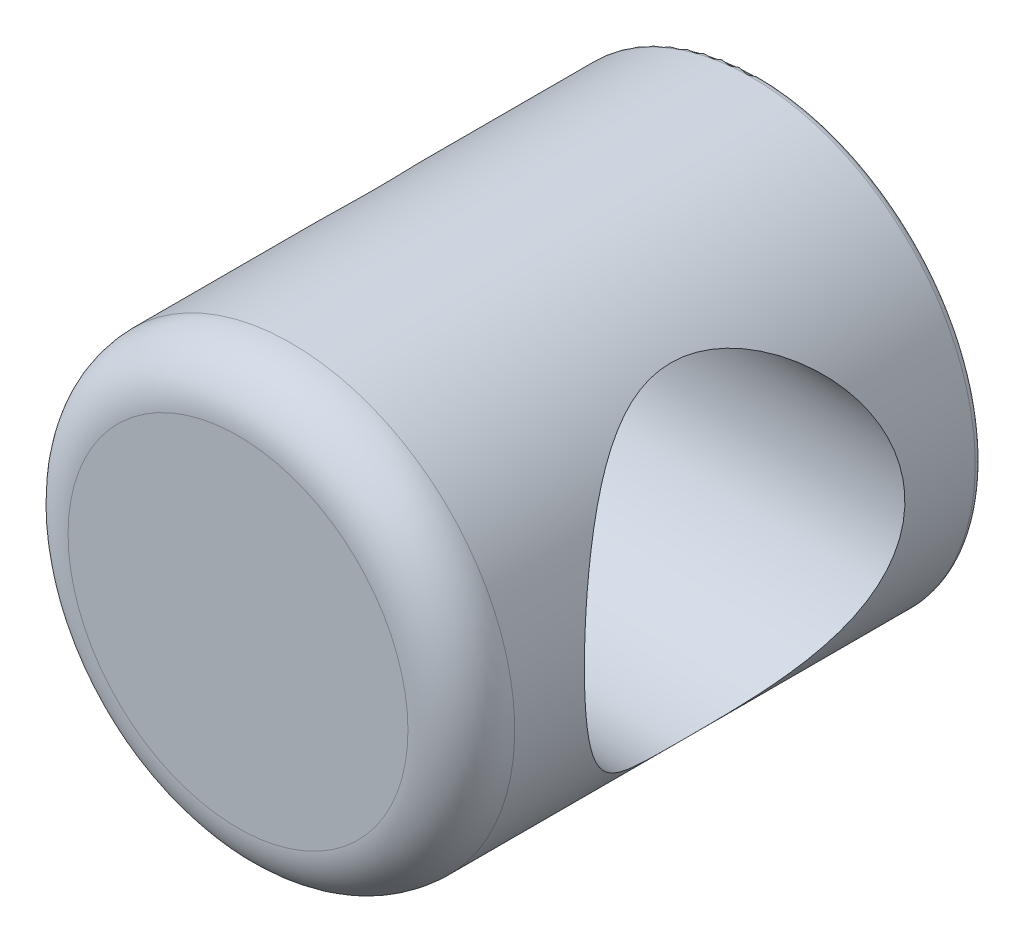
ISO-10303-21;
HEADER;
FILE_DESCRIPTION(('STEP AP214'),'2;1');
FILE_NAME('part.step','',(''),(''),'','','');
FILE_SCHEMA(('AUTOMOTIVE_DESIGN { 1 0 10303 214 1 1 1 1 }'));
ENDSEC;
DATA;
#1=APPLICATION_CONTEXT('core data for automotive mechanical design processes');
#2=APPLICATION_PROTOCOL_DEFINITION('international standard','automotive_design',2000,#1);
#3=PRODUCT_CONTEXT('',#1,'mechanical');
#4=PRODUCT('Part','Part','',(#3));
#5=PRODUCT_RELATED_PRODUCT_CATEGORY('part','',(#4));
#6=PRODUCT_DEFINITION_FORMATION('','',#4);
#7=PRODUCT_DEFINITION_CONTEXT('part definition',#1,'design');
#8=PRODUCT_DEFINITION('design','',#6,#7);
#9=PRODUCT_DEFINITION_SHAPE('','',#8);
#10=(LENGTH_UNIT() NAMED_UNIT(*) SI_UNIT(.MILLI.,.METRE.));
#11=(NAMED_UNIT(*) PLANE_ANGLE_UNIT() SI_UNIT($,.RADIAN.));
#12=(NAMED_UNIT(*) SI_UNIT($,.STERADIAN.) SOLID_ANGLE_UNIT());
#13=UNCERTAINTY_MEASURE_WITH_UNIT(LENGTH_MEASURE(1.E-05),#10,'distance_accuracy_value','');
#14=(GEOMETRIC_REPRESENTATION_CONTEXT(3) GLOBAL_UNCERTAINTY_ASSIGNED_CONTEXT((#13)) GLOBAL_UNIT_ASSIGNED_CONTEXT((#10,
#11,#12)) REPRESENTATION_CONTEXT('',''));
#15=CARTESIAN_POINT('',(0.,0.,0.));
#16=DIRECTION('',(0.,0.,1.));
#17=DIRECTION('',(1.,0.,0.));
#18=AXIS2_PLACEMENT_3D('',#15,#16,#17);
#19=CARTESIAN_POINT('',(-43.1651379196429,140.05913529547,39.));
#20=DIRECTION('',(0.,0.,1.));
#21=DIRECTION('',(1.,0.,0.));
#22=AXIS2_PLACEMENT_3D('',#19,#20,#21);
#23=PLANE('',#22);
#24=CARTESIAN_POINT('',(-43.1651379196429,140.05913529547,39.));
#25=DIRECTION('',(0.,0.,-1.));
#26=DIRECTION('',(-1.,0.,0.));
#27=AXIS2_PLACEMENT_3D('',#24,#25,#26);
#28=CIRCLE('',#27,12.7313780722573);
#29=CARTESIAN_POINT('',(-55.8965159919001,140.05913529547,39.));
#30=VERTEX_POINT('',#29);
#31=CARTESIAN_POINT('',(-30.4337598473856,140.05913529547,39.));
#32=VERTEX_POINT('',#31);
#33=EDGE_CURVE('E46',#30,#32,#28,.T.);
#34=ORIENTED_EDGE('',*,*,#33,.F.);
#35=CARTESIAN_POINT('',(-43.1651379196429,140.05913529547,39.));
#36=DIRECTION('',(0.,0.,-1.));
#37=DIRECTION('',(1.,0.,0.));
#38=AXIS2_PLACEMENT_3D('',#35,#36,#37);
#39=CIRCLE('',#38,12.7313780722573);
#40=EDGE_CURVE('E50',#32,#30,#39,.T.);
#41=ORIENTED_EDGE('',*,*,#40,.F.);
#42=EDGE_LOOP('',(#34,#41));
#43=FACE_BOUND('',#42,.T.);
#44=ADVANCED_FACE('F17',(#43),#23,.T.);
#45=CARTESIAN_POINT('',(-43.1651379196429,140.05913529547,0.));
#46=DIRECTION('',(0.,0.,1.));
#47=DIRECTION('',(1.,0.,0.));
#48=AXIS2_PLACEMENT_3D('',#45,#46,#47);
#49=PLANE('',#48);
#50=CARTESIAN_POINT('',(-43.1651379196429,140.05913529547,0.));
#51=DIRECTION('',(0.,0.,1.));
#52=DIRECTION('',(1.,0.,0.));
#53=AXIS2_PLACEMENT_3D('',#50,#51,#52);
#54=CIRCLE('',#53,16.2313780722573);
#55=CARTESIAN_POINT('',(-26.9337598473856,140.05913529547,0.));
#56=VERTEX_POINT('',#55);
#57=CARTESIAN_POINT('',(-59.3965159919001,140.05913529547,0.));
#58=VERTEX_POINT('',#57);
#59=EDGE_CURVE('E37',#56,#58,#54,.T.);
#60=ORIENTED_EDGE('',*,*,#59,.F.);
#61=CARTESIAN_POINT('',(-43.1651379196429,140.05913529547,0.));
#62=DIRECTION('',(0.,0.,1.));
#63=DIRECTION('',(-1.,0.,0.));
#64=AXIS2_PLACEMENT_3D('',#61,#62,#63);
#65=CIRCLE('',#64,16.2313780722573);
#66=EDGE_CURVE('E56',#58,#56,#65,.T.);
#67=ORIENTED_EDGE('',*,*,#66,.F.);
#68=EDGE_LOOP('',(#60,#67));
#69=FACE_BOUND('',#68,.T.);
#70=ADVANCED_FACE('F78',(#69),#49,.F.);
#71=CARTESIAN_POINT('',(-43.1651379196429,140.05913529547,35.));
#72=DIRECTION('',(0.,0.,1.));
#73=DIRECTION('',(1.,0.,0.));
#74=AXIS2_PLACEMENT_3D('',#71,#72,#73);
#75=TOROIDAL_SURFACE('',#74,12.7313780722573,4.);
#76=CARTESIAN_POINT('',(-43.1651379196429,140.05913529547,35.));
#77=DIRECTION('',(0.,0.,-1.));
#78=DIRECTION('',(-1.,0.,0.));
#79=AXIS2_PLACEMENT_3D('',#76,#77,#78);
#80=CIRCLE('',#79,16.7313780722573);
#81=CARTESIAN_POINT('',(-59.8965159919001,140.05913529547,35.));
#82=VERTEX_POINT('',#81);
#83=EDGE_CURVE('E86',#82,#82,#80,.T.);
#84=ORIENTED_EDGE('',*,*,#83,.F.);
#85=EDGE_LOOP('',(#84));
#86=FACE_BOUND('',#85,.T.);
#87=ORIENTED_EDGE('',*,*,#40,.T.);
#88=ORIENTED_EDGE('',*,*,#33,.T.);
#89=EDGE_LOOP('',(#87,#88));
#90=FACE_BOUND('',#89,.T.);
#91=ADVANCED_FACE('F55',(#86,#90),#75,.T.);
#92=CARTESIAN_POINT('',(-43.1651379196429,140.05913529547,0.5));
#93=DIRECTION('',(0.,0.,1.));
#94=DIRECTION('',(1.,0.,0.));
#95=AXIS2_PLACEMENT_3D('',#92,#93,#94);
#96=TOROIDAL_SURFACE('',#95,16.2313780722573,0.5);
#97=ORIENTED_EDGE('',*,*,#59,.T.);
#98=ORIENTED_EDGE('',*,*,#66,.T.);
#99=EDGE_LOOP('',(#97,#98));
#100=FACE_BOUND('',#99,.T.);
#101=CARTESIAN_POINT('',(-43.1651379196429,140.05913529547,0.5));
#102=DIRECTION('',(0.,0.,-1.));
#103=DIRECTION('',(-1.,0.,0.));
#104=AXIS2_PLACEMENT_3D('',#101,#102,#103);
#105=CIRCLE('',#104,16.7313780722573);
#106=CARTESIAN_POINT('',(-59.8965159919001,140.05913529547,0.5));
#107=VERTEX_POINT('',#106);
#108=EDGE_CURVE('E29',#107,#107,#105,.F.);
#109=ORIENTED_EDGE('',*,*,#108,.F.);
#110=EDGE_LOOP('',(#109));
#111=FACE_BOUND('',#110,.T.);
#112=ADVANCED_FACE('F77',(#100,#111),#96,.T.);
#113=CARTESIAN_POINT('',(-26.2654321668621,140.444222223618,17.7650718711062));
#114=DIRECTION('',(-0.999951647222079,0.00983377942867071,0.));
#115=DIRECTION('',(-0.00983377942867071,-0.999951647222079,0.));
#116=AXIS2_PLACEMENT_3D('',#113,#114,#115);
#117=CYLINDRICAL_SURFACE('',#116,12.);
#118=CARTESIAN_POINT('',(-31.9785682801819,152.500986922069,17.7650718711062));
#119=CARTESIAN_POINT('',(-31.9785662023825,152.500985905451,17.4859511396335));
#120=CARTESIAN_POINT('',(-31.9675579552881,152.491114020165,17.2068183317744));
#121=CARTESIAN_POINT('',(-31.9241893562265,152.45191208348,16.6514729773379));
#122=CARTESIAN_POINT('',(-31.8918165337809,152.422570667682,16.3752622320933));
#123=CARTESIAN_POINT('',(-31.807473653693,152.345132717907,15.8278657172617));
#124=CARTESIAN_POINT('',(-31.7554551856647,152.296989843706,15.5566941111676));
#125=CARTESIAN_POINT('',(-31.6344342951344,152.183027863602,15.0218528870119));
#126=CARTESIAN_POINT('',(-31.565421546838,152.117198008795,14.7581879390937));
#127=CARTESIAN_POINT('',(-31.4144638694808,151.97012176487,14.2434813370643));
#128=CARTESIAN_POINT('',(-31.3327192785392,151.889110797159,13.9923126471324));
#129=CARTESIAN_POINT('',(-31.1583789347836,151.712125086147,13.4992696100049));
#130=CARTESIAN_POINT('',(-31.0657843574644,151.616151963483,13.2573942597261));
#131=CARTESIAN_POINT('',(-30.8723168792532,151.410149248864,12.7832909577338));
#132=CARTESIAN_POINT('',(-30.7714471403774,151.300125017104,12.5510593716682));
#133=CARTESIAN_POINT('',(-30.5636464138587,151.066671622314,12.0962325171486));
#134=CARTESIAN_POINT('',(-30.4567144921646,150.943240390856,11.8736387430428));
#135=CARTESIAN_POINT('',(-30.216344025235,150.656754051546,11.3933074585893));
#136=CARTESIAN_POINT('',(-30.0819819954451,150.490773787916,11.1377734811519));
#137=CARTESIAN_POINT('',(-29.8104104589503,150.140769845745,10.6409768587832));
#138=CARTESIAN_POINT('',(-29.6732007194718,149.956744687585,10.3997153867515));
#139=CARTESIAN_POINT('',(-29.3984314312415,149.570863685418,9.93145894337228));
#140=CARTESIAN_POINT('',(-29.2608716597804,149.368984676506,9.70448318040005));
#141=CARTESIAN_POINT('',(-28.9880156312181,148.947958008641,9.26566154054692));
#142=CARTESIAN_POINT('',(-28.8527195624913,148.728808921135,9.05381691805874));
#143=CARTESIAN_POINT('',(-28.5575964022027,148.223809677029,8.60145782838516));
#144=CARTESIAN_POINT('',(-28.3988665111614,147.933846235048,8.3647890415022));
#145=CARTESIAN_POINT('',(-28.0920926869214,147.329431162936,7.91692154606321));
#146=CARTESIAN_POINT('',(-27.944051272944,147.014973795778,7.70572883427583));
#147=CARTESIAN_POINT('',(-27.6627594753364,146.363189020009,7.31157377455342));
#148=CARTESIAN_POINT('',(-27.5294897195722,146.02589252212,7.12857432696806));
#149=CARTESIAN_POINT('',(-27.2813814091488,145.32995679652,6.79340228806014));
#150=CARTESIAN_POINT('',(-27.1665330654252,144.971329043979,6.64121331282803));
#151=CARTESIAN_POINT('',(-26.9892329081226,144.343102508521,6.41023753697354));
#152=CARTESIAN_POINT('',(-26.9212790586393,144.078128892285,6.32299915850926));
#153=CARTESIAN_POINT('',(-26.7975618055592,143.540165544165,6.16651535869581));
#154=CARTESIAN_POINT('',(-26.7417954921673,143.267177743376,6.09726564177667));
#155=CARTESIAN_POINT('',(-26.6435840265351,142.715379298103,5.97785593536057));
#156=CARTESIAN_POINT('',(-26.6011083988957,142.43658356167,5.92765221654858));
#157=CARTESIAN_POINT('',(-26.5301251229493,141.874494924413,5.84692194583445));
#158=CARTESIAN_POINT('',(-26.5016111042649,141.591204135614,5.81638641775624));
#159=CARTESIAN_POINT('',(-26.4648463946921,141.099548948305,5.7810724120702));
#160=CARTESIAN_POINT('',(-26.4531936942391,140.891762983519,5.77154722352522));
#161=CARTESIAN_POINT('',(-26.4376488192335,140.475646366325,5.7633054570111));
#162=CARTESIAN_POINT('',(-26.4337581931387,140.267315613538,5.76459103541723));
#163=CARTESIAN_POINT('',(-26.4337622077734,139.762090001587,5.78088481305406));
#164=CARTESIAN_POINT('',(-26.4416890364116,139.465350984503,5.80151647390374));
#165=CARTESIAN_POINT('',(-26.473099925989,138.874919145602,5.86467576413347));
#166=CARTESIAN_POINT('',(-26.4965923551398,138.581228048682,5.90721516857868));
#167=CARTESIAN_POINT('',(-26.5585192476096,137.998752820824,6.01372508266429));
#168=CARTESIAN_POINT('',(-26.5969836613341,137.709979744279,6.0777385138998));
#169=CARTESIAN_POINT('',(-26.6878398452776,137.140072085699,6.22630462055584));
#170=CARTESIAN_POINT('',(-26.7402299501546,136.858936594731,6.31085483992382));
#171=CARTESIAN_POINT('',(-26.8573359009094,136.30766166264,6.49888489270672));
#172=CARTESIAN_POINT('',(-26.92197733799,136.037467212322,6.60225030877016));
#173=CARTESIAN_POINT('',(-27.0623776963134,135.507737645405,6.82710084984151));
#174=CARTESIAN_POINT('',(-27.1381369050255,135.248202804651,6.94858644337919));
#175=CARTESIAN_POINT('',(-27.2992094120045,134.741045358288,7.20844330781135));
#176=CARTESIAN_POINT('',(-27.3845172453378,134.49341605367,7.34680492413194));
#177=CARTESIAN_POINT('',(-27.563175799389,134.010658656882,7.6394099401741));
#178=CARTESIAN_POINT('',(-27.6565295136992,133.775535270804,7.79365925535575));
#179=CARTESIAN_POINT('',(-27.8584154790876,133.297738574141,8.13167538770496));
#180=CARTESIAN_POINT('',(-27.9675562321119,133.056319057739,8.31685069900514));
#181=CARTESIAN_POINT('',(-28.1913227433103,132.589810707739,8.70368778765544));
#182=CARTESIAN_POINT('',(-28.305948653356,132.364722326747,8.90535002160077));
#183=CARTESIAN_POINT('',(-28.5386876180362,131.930997640935,9.32454407085449));
#184=CARTESIAN_POINT('',(-28.6568059268655,131.722388060777,9.54210060614943));
#185=CARTESIAN_POINT('',(-28.8940375640297,131.322502006989,9.99197181615615));
#186=CARTESIAN_POINT('',(-29.0131507087255,131.131222408373,10.2242838172229));
#187=CARTESIAN_POINT('',(-29.2701473409079,130.735351408003,10.7438925215942));
#188=CARTESIAN_POINT('',(-29.407779550374,130.534024662111,11.0338229550073));
#189=CARTESIAN_POINT('',(-29.6095710930748,130.251022562248,11.4826623336595));
#190=CARTESIAN_POINT('',(-29.6760653272484,130.15984490517,11.6346155518897));
#191=CARTESIAN_POINT('',(-29.8069616305609,129.983910014896,11.9431865433706));
#192=CARTESIAN_POINT('',(-29.8713626405776,129.899156003897,12.0998066034176));
#193=CARTESIAN_POINT('',(-30.0603066413653,129.655065265831,12.5760165882007));
#194=CARTESIAN_POINT('',(-30.1807927117888,129.505620372558,12.9023985192365));
#195=CARTESIAN_POINT('',(-30.4054926369037,129.235021669651,13.5719574596406));
#196=CARTESIAN_POINT('',(-30.5097144371651,129.113854031328,13.9151261598771));
#197=CARTESIAN_POINT('',(-30.676868229246,128.923846078821,14.5437615230582));
#198=CARTESIAN_POINT('',(-30.7438807314935,128.849365159937,14.8264377592485));
#199=CARTESIAN_POINT('',(-30.8613030630986,128.720604560083,15.3997531357217));
#200=CARTESIAN_POINT('',(-30.9117156437121,128.666321531339,15.6903909478021));
#201=CARTESIAN_POINT('',(-30.9933884599684,128.579104147669,16.2768315939176));
#202=CARTESIAN_POINT('',(-31.0246938048613,128.546119499778,16.5726205538982));
#203=CARTESIAN_POINT('',(-31.0666367443472,128.502049660744,17.167299000377));
#204=CARTESIAN_POINT('',(-31.0772753709104,128.49096337613,17.4661883313122));
#205=CARTESIAN_POINT('',(-31.0772771839509,128.490962365248,18.0562261509787));
#206=CARTESIAN_POINT('',(-31.0671834479619,128.501481686811,18.3473749353601));
#207=CARTESIAN_POINT('',(-31.0273633063681,128.543308789583,18.9268043329283));
#208=CARTESIAN_POINT('',(-30.9976365026209,128.574616992374,19.2150848878295));
#209=CARTESIAN_POINT('',(-30.9200169226186,128.657415035261,19.7867480612455));
#210=CARTESIAN_POINT('',(-30.8720912882109,128.708941385043,20.0701208453352));
#211=CARTESIAN_POINT('',(-30.7603133483958,128.831215758357,20.6294451444351));
#212=CARTESIAN_POINT('',(-30.6964600809605,128.901964942969,20.9053962100582));
#213=CARTESIAN_POINT('',(-30.5561752807077,129.06076461218,21.4455012686082));
#214=CARTESIAN_POINT('',(-30.4798871519317,129.148619840904,21.7097505293559));
#215=CARTESIAN_POINT('',(-30.3168060488824,129.34114626102,22.2287206278885));
#216=CARTESIAN_POINT('',(-30.2300112576456,129.445820362001,22.4834398075956));
#217=CARTESIAN_POINT('',(-30.0483892387751,129.671120749421,22.9827192334368));
#218=CARTESIAN_POINT('',(-29.9535621268998,129.791746805981,23.2272796258994));
#219=CARTESIAN_POINT('',(-29.7581854817077,130.048210156257,23.7057798777406));
#220=CARTESIAN_POINT('',(-29.6576375435041,130.184043219992,23.939722665192));
#221=CARTESIAN_POINT('',(-29.4356209593364,130.49453061182,24.4352741320286));
#222=CARTESIAN_POINT('',(-29.3134816715468,130.671869869377,24.6949034762396));
#223=CARTESIAN_POINT('',(-29.0672282898564,131.045916596658,25.1988256022132));
#224=CARTESIAN_POINT('',(-28.9431140516773,131.242625486912,25.4431172569861));
#225=CARTESIAN_POINT('',(-28.6955446613619,131.65510052694,25.9159748235457));
#226=CARTESIAN_POINT('',(-28.5720903999125,131.870887710917,26.1445228712785));
#227=CARTESIAN_POINT('',(-28.3285844124716,132.320844267138,26.5847487700682));
#228=CARTESIAN_POINT('',(-28.2085328999053,132.555014788953,26.7964255644388));
#229=CARTESIAN_POINT('',(-27.9574251963634,133.076313706434,27.2310965527481));
#230=CARTESIAN_POINT('',(-27.8272800463901,133.366208376985,27.4513177996903));
#231=CARTESIAN_POINT('',(-27.5783502812552,133.968387125524,27.8662929884742));
#232=CARTESIAN_POINT('',(-27.459567499032,134.280674801705,28.0610428232096));
#233=CARTESIAN_POINT('',(-27.2371261527743,134.925559906496,28.4224090541412));
#234=CARTESIAN_POINT('',(-27.1334434790351,135.258123729153,28.5890703665158));
#235=CARTESIAN_POINT('',(-26.9444218040015,135.941735444165,28.8920504250628));
#236=CARTESIAN_POINT('',(-26.8590754509241,136.292775857948,29.0283813327202));
#237=CARTESIAN_POINT('',(-26.728006716523,136.922797519109,29.2389947309635));
#238=CARTESIAN_POINT('',(-26.6776965210704,137.198498734278,29.3203020953964));
#239=CARTESIAN_POINT('',(-26.5904847556362,137.757025305946,29.4631806834393));
#240=CARTESIAN_POINT('',(-26.5535804056172,138.039849172362,29.5247559986708));
#241=CARTESIAN_POINT('',(-26.4941219311718,138.610518606261,29.6273550526757));
#242=CARTESIAN_POINT('',(-26.4715591652706,138.898361042181,29.6683911641047));
#243=CARTESIAN_POINT('',(-26.4413777086488,139.477065533742,29.7294389924418));
#244=CARTESIAN_POINT('',(-26.4337596704965,139.767927720685,29.7494497912523));
#245=CARTESIAN_POINT('',(-26.4337600269854,140.354805512141,29.7683716671253));
#246=CARTESIAN_POINT('',(-26.4416137030317,140.650831783632,29.7669546998182));
#247=CARTESIAN_POINT('',(-26.4729468580807,141.24114149813,29.7423588708154));
#248=CARTESIAN_POINT('',(-26.4964264721135,141.535424926053,29.7191798210636));
#249=CARTESIAN_POINT('',(-26.5585668485111,142.12002281222,29.6515370793959));
#250=CARTESIAN_POINT('',(-26.5972338635305,142.410335584737,29.6070646193266));
#251=CARTESIAN_POINT('',(-26.6889594053201,142.984738571427,29.4976234960825));
#252=CARTESIAN_POINT('',(-26.7420180994325,143.268828713202,29.4326545945795));
#253=CARTESIAN_POINT('',(-26.8611667631456,143.827519475224,29.2836157460174));
#254=CARTESIAN_POINT('',(-26.9271892872544,144.102160911194,29.199644330292));
#255=CARTESIAN_POINT('',(-27.0712026565785,144.641962249678,29.0135502742997));
#256=CARTESIAN_POINT('',(-27.1491934532988,144.907122190605,28.9114277075802));
#257=CARTESIAN_POINT('',(-27.3157760099628,145.42673934503,28.6902279857418));
#258=CARTESIAN_POINT('',(-27.4043659484374,145.681198387355,28.571153743113));
#259=CARTESIAN_POINT('',(-27.5907669549721,146.178659234092,28.3171468133794));
#260=CARTESIAN_POINT('',(-27.6885814575734,146.421656720154,28.1822082149204));
#261=CARTESIAN_POINT('',(-27.9009384390872,146.916390379323,27.8849985193978));
#262=CARTESIAN_POINT('',(-28.0161953126322,147.167001279355,27.721365831728));
#263=CARTESIAN_POINT('',(-28.2539690024015,147.653165241632,27.3778623822574));
#264=CARTESIAN_POINT('',(-28.376485989131,147.888717949962,27.1979912390413));
#265=CARTESIAN_POINT('',(-28.6270217209436,148.3446610796,26.8227875824742));
#266=CARTESIAN_POINT('',(-28.7550476285087,148.565030729595,26.6274346445687));
#267=CARTESIAN_POINT('',(-29.0144319052163,148.989895595132,26.2223415094255));
#268=CARTESIAN_POINT('',(-29.1457896861663,149.194393587053,26.0126038406098));
#269=CARTESIAN_POINT('',(-29.4361356609156,149.626478622694,25.5360606327486));
#270=CARTESIAN_POINT('',(-29.5954092868829,149.85053578248,25.2662163364136));
#271=CARTESIAN_POINT('',(-29.9119399889988,150.274900009784,24.7072176027933));
#272=CARTESIAN_POINT('',(-30.0691964728007,150.475200237159,24.4180576413835));
#273=CARTESIAN_POINT('',(-30.3771060185904,150.850992755054,23.8209141100328));
#274=CARTESIAN_POINT('',(-30.527763039319,151.026500062388,23.5129420976961));
#275=CARTESIAN_POINT('',(-30.817183261302,151.351360745927,22.8784709368862));
#276=CARTESIAN_POINT('',(-30.955952822702,151.500728152944,22.5519818529936));
#277=CARTESIAN_POINT('',(-31.2599725740343,151.817935560096,21.7652115741641));
#278=CARTESIAN_POINT('',(-31.4180404089782,151.974613177304,21.2973710039446));
#279=CARTESIAN_POINT('',(-31.6170298774569,152.166518876063,20.5746927689307));
#280=CARTESIAN_POINT('',(-31.6769610900293,152.223262210211,20.3306030996418));
#281=CARTESIAN_POINT('',(-31.7820130681073,152.321625179574,19.8362951137097));
#282=CARTESIAN_POINT('',(-31.8271406394915,152.363251765562,19.5860796703715));
#283=CARTESIAN_POINT('',(-31.9014302960027,152.431302718397,19.0754694759157));
#284=CARTESIAN_POINT('',(-31.930218051044,152.457371305272,18.8149719431985));
#285=CARTESIAN_POINT('',(-31.9687901276728,152.492215801919,18.2913441886433));
#286=CARTESIAN_POINT('',(-31.9785702390307,152.500987880487,18.0282133965039));
#287=CARTESIAN_POINT('',(-31.9785682801819,152.500986922069,17.7650718711062));
#288=B_SPLINE_CURVE_WITH_KNOTS('',3,(#118,#119,#120,#121,#122,#123,#124,#125,#126,#127,#128,
#129,#130,#131,#132,#133,#134,#135,#136,#137,#138,#139,#140,#141,#142,#143,#144,#145,#146,#147,
#148,#149,#150,#151,#152,#153,#154,#155,#156,#157,#158,#159,#160,#161,#162,#163,#164,#165,#166,
#167,#168,#169,#170,#171,#172,#173,#174,#175,#176,#177,#178,#179,#180,#181,#182,#183,#184,#185,
#186,#187,#188,#189,#190,#191,#192,#193,#194,#195,#196,#197,#198,#199,#200,#201,#202,#203,#204,
#205,#206,#207,#208,#209,#210,#211,#212,#213,#214,#215,#216,#217,#218,#219,#220,#221,#222,#223,
#224,#225,#226,#227,#228,#229,#230,#231,#232,#233,#234,#235,#236,#237,#238,#239,#240,#241,#242,
#243,#244,#245,#246,#247,#248,#249,#250,#251,#252,#253,#254,#255,#256,#257,#258,#259,#260,#261,
#262,#263,#264,#265,#266,#267,#268,#269,#270,#271,#272,#273,#274,#275,#276,#277,#278,#279,#280,
#281,#282,#283,#284,#285,#286,#287),.UNSPECIFIED.,.T.,.F.,(4,2,2,2,2,2,2,2,2,2,2,2,2,2,2,2,2,2,
2,2,2,2,2,2,2,2,2,2,2,2,2,2,2,2,2,2,2,2,2,2,2,2,2,2,2,2,2,2,2,2,2,2,2,2,2,2,2,2,2,2,2,2,2,2,2,2,
2,2,2,2,2,2,2,2,2,2,2,2,2,2,2,2,2,2,4),(0.,0.837002973235145,1.67449493677612,2.51406424010891,
3.35414493338199,4.18213948834295,5.01004442061562,5.83763446316709,6.6653523678384,
7.66353849488662,8.6618065382055,9.66138936274166,10.6610549581433,11.8790865055075,
13.0974042060171,14.3141047651101,15.530156616924,16.3906815824877,17.2510008712536,
18.1093327505882,18.9672726260297,19.5918590729174,20.2165701062214,21.1079486678546,
21.9998068321412,22.8934583418497,23.7870030298236,24.6752852463209,25.563590434936,
26.4513897974487,27.3395209170828,28.3083150501864,29.2771360225444,30.2474972404896,
31.2176831308108,32.3527946574839,32.9204657131465,33.4884196617838,34.6226510780412,
35.7563266427589,36.6549246460263,37.553373641414,38.4496932483073,39.345968097293,
40.2190648841023,41.0921793771323,41.9668778399482,42.8416291472957,43.7069261885003,
44.5723730836882,45.4378075085381,46.3030017994701,47.3139623203119,48.3249970382517,
49.3371606842427,50.3493876746939,51.5076466758853,52.6660922094668,53.8226673325447,
54.9787778682363,55.853229858336,56.727500405287,57.6012436627377,58.4750250717391,
59.3621968381792,60.2493762711388,61.1369213394716,62.0244767283692,62.9075313574144,
63.7905824084481,64.6734819239881,65.5567114732732,66.51798894667,67.4792890048104,
68.4418790850886,69.404300401195,70.5586767036883,71.7133845737748,72.8673900226818,
74.0207741368679,75.5687451373669,76.340976943588,77.1128532220143,77.9017644164087,
78.6908503362452),.UNSPECIFIED.);
#289=CARTESIAN_POINT('',(-31.9785682801819,152.500986922069,17.7650718711062));
#290=VERTEX_POINT('',#289);
#291=EDGE_CURVE('E11',#290,#290,#288,.T.);
#292=ORIENTED_EDGE('',*,*,#291,.F.);
#293=EDGE_LOOP('',(#292));
#294=FACE_BOUND('',#293,.T.);
#295=CARTESIAN_POINT('',(-59.8965159919001,140.05913529547,29.7437047710954));
#296=CARTESIAN_POINT('',(-59.8965146738317,139.758976362281,29.7257681041538));
#297=CARTESIAN_POINT('',(-59.8884206778582,139.459471011958,29.6965392654387));
#298=CARTESIAN_POINT('',(-59.8564547165935,138.864200625604,29.6158541155874));
#299=CARTESIAN_POINT('',(-59.8325751438618,138.568437463095,29.564387091491));
#300=CARTESIAN_POINT('',(-59.7697705795027,137.982563200181,29.439827196369));
#301=CARTESIAN_POINT('',(-59.7308176069933,137.692463671516,29.3666941660847));
#302=CARTESIAN_POINT('',(-59.6389879957213,137.12057159982,29.1998308024315));
#303=CARTESIAN_POINT('',(-59.5861127946186,136.838778202408,29.1061025959605));
#304=CARTESIAN_POINT('',(-59.4681569682253,136.286905355761,28.8998389463293));
#305=CARTESIAN_POINT('',(-59.4031543942662,136.016763891805,28.7874242469183));
#306=CARTESIAN_POINT('',(-59.2622136021734,135.487688499502,28.5445781942494));
#307=CARTESIAN_POINT('',(-59.1862751651059,135.228754795668,28.4141464802965));
#308=CARTESIAN_POINT('',(-59.0250904640609,134.723289226573,28.1365313719796));
#309=CARTESIAN_POINT('',(-58.9398495686166,134.476750326911,27.9893576375304));
#310=CARTESIAN_POINT('',(-58.7616283547697,133.996618864576,27.6792537323919));
#311=CARTESIAN_POINT('',(-58.6686451902462,133.763031115886,27.5163177637842));
#312=CARTESIAN_POINT('',(-58.4671025790558,133.286974728558,27.1588188962141));
#313=CARTESIAN_POINT('',(-58.3579130522936,133.045924713509,26.9627220179056));
#314=CARTESIAN_POINT('',(-58.134495278781,132.580906599789,26.5538717320566));
#315=CARTESIAN_POINT('',(-58.0202667828427,132.356939347396,26.3411175003701));
#316=CARTESIAN_POINT('',(-57.7888821973758,131.926177713217,25.8994342373814));
#317=CARTESIAN_POINT('',(-57.6717207804815,131.719418055347,25.670474146876));
#318=CARTESIAN_POINT('',(-57.4371945302191,131.324135584416,25.1975411555669));
#319=CARTESIAN_POINT('',(-57.3198297531473,131.135608355643,24.9535719133675));
#320=CARTESIAN_POINT('',(-57.0688153988631,130.74848746585,24.4106846979987));
#321=CARTESIAN_POINT('',(-56.935582192834,130.553150529515,24.109239531513));
#322=CARTESIAN_POINT('',(-56.6769075030662,130.188927041941,23.4874348443635));
#323=CARTESIAN_POINT('',(-56.5514680913542,130.020047506558,23.16707033766));
#324=CARTESIAN_POINT('',(-56.3138552415624,129.710793048329,22.5091069894493));
#325=CARTESIAN_POINT('',(-56.2016514304561,129.570352311145,22.1715502563376));
#326=CARTESIAN_POINT('',(-55.9959141948876,129.319650148665,21.4799964527422));
#327=CARTESIAN_POINT('',(-55.9023686201631,129.20936906589,21.1260102675178));
#328=CARTESIAN_POINT('',(-55.7667754483743,129.05256335435,20.523918142697));
#329=CARTESIAN_POINT('',(-55.7179396734001,128.997025585086,20.2796556076373));
#330=CARTESIAN_POINT('',(-55.6328325446354,128.90119078058,19.7860291045161));
#331=CARTESIAN_POINT('',(-55.5965575594079,128.86088934007,19.5366666330091));
#332=CARTESIAN_POINT('',(-55.537960643576,128.796178933988,19.0345721809408));
#333=CARTESIAN_POINT('',(-55.5156210500731,128.771749848805,18.7818448821493));
#334=CARTESIAN_POINT('',(-55.4857226214969,128.739122377417,18.2744422529625));
#335=CARTESIAN_POINT('',(-55.4781654166424,128.730925781349,18.0197667108214));
#336=CARTESIAN_POINT('',(-55.4781717902268,128.73092937399,17.4739586742783));
#337=CARTESIAN_POINT('',(-55.4880519740597,128.741641694006,17.1828202666743));
#338=CARTESIAN_POINT('',(-55.5270356703006,128.784238254778,16.6033922342387));
#339=CARTESIAN_POINT('',(-55.5561419166873,128.81612550665,16.3151030204859));
#340=CARTESIAN_POINT('',(-55.632110844325,128.900425684121,15.7434915629617));
#341=CARTESIAN_POINT('',(-55.6790010707795,128.952870455041,15.4601777413554));
#342=CARTESIAN_POINT('',(-55.7883461590873,129.077310794698,14.9008403565133));
#343=CARTESIAN_POINT('',(-55.8508092971057,129.149316760988,14.6248207563081));
#344=CARTESIAN_POINT('',(-55.9879711873257,129.310878161614,14.0846086061101));
#345=CARTESIAN_POINT('',(-56.0625284708285,129.400232796653,13.8203196456818));
#346=CARTESIAN_POINT('',(-56.2217844145558,129.595916456719,13.3013876852643));
#347=CARTESIAN_POINT('',(-56.3064822915202,129.702244170956,13.0467439422751));
#348=CARTESIAN_POINT('',(-56.5721213394469,130.045388617799,12.298043890925));
#349=CARTESIAN_POINT('',(-56.7646909798531,130.306459926321,11.8189122875164));
#350=CARTESIAN_POINT('',(-57.0801467893427,130.766444107612,11.0947838326509));
#351=CARTESIAN_POINT('',(-57.1987384518707,130.946107737458,10.8352263264876));
#352=CARTESIAN_POINT('',(-57.4375584291194,131.324887947611,10.331362283767));
#353=CARTESIAN_POINT('',(-57.5577868655475,131.524005981386,10.0870568889558));
#354=CARTESIAN_POINT('',(-57.7972035097278,131.941277038732,9.61418422713678));
#355=CARTESIAN_POINT('',(-57.9163903525024,132.15945182613,9.38563550223343));
#356=CARTESIAN_POINT('',(-58.1510030365868,132.614116466688,8.94540396986451));
#357=CARTESIAN_POINT('',(-58.2664286602325,132.850607377148,8.73372213747589));
#358=CARTESIAN_POINT('',(-58.5072600597849,133.376796670902,8.29900693964753));
#359=CARTESIAN_POINT('',(-58.6316991548336,133.669246387958,8.07875047007166));
#360=CARTESIAN_POINT('',(-58.8687769839643,134.276322692026,7.6637086393986));
#361=CARTESIAN_POINT('',(-58.9814135580896,134.590953320761,7.46892793895956));
#362=CARTESIAN_POINT('',(-59.1911236799339,135.240119486092,7.10757231467665));
#363=CARTESIAN_POINT('',(-59.2882270542781,135.57461514163,6.94094329895119));
#364=CARTESIAN_POINT('',(-59.4637282638342,136.261702254449,6.6380303514907));
#365=CARTESIAN_POINT('',(-59.5421352737509,136.614284732493,6.50173153828045));
#366=CARTESIAN_POINT('',(-59.6559542421151,137.220986920776,6.29969968227773));
#367=CARTESIAN_POINT('',(-59.6971312609603,137.471167510635,6.22525895189005));
#368=CARTESIAN_POINT('',(-59.7684569720499,137.977293514788,6.09249354968768));
#369=CARTESIAN_POINT('',(-59.7986078834457,138.233237758049,6.03416563553231));
#370=CARTESIAN_POINT('',(-59.8471846112276,138.749367228336,5.93425289709492));
#371=CARTESIAN_POINT('',(-59.8656152621452,139.00955066124,5.89266117184678));
#372=CARTESIAN_POINT('',(-59.8902821340379,139.532689370321,5.82662483844763));
#373=CARTESIAN_POINT('',(-59.8965169690602,139.795644958117,5.80218217934743));
#374=CARTESIAN_POINT('',(-59.896514908243,140.351342490539,5.76897996763071));
#375=CARTESIAN_POINT('',(-59.8888447060574,140.644207347773,5.76221999065483));
#376=CARTESIAN_POINT('',(-59.8581451774235,141.228848494465,5.77010512005722));
#377=CARTESIAN_POINT('',(-59.8351148270514,141.52062471005,5.78475165349376));
#378=CARTESIAN_POINT('',(-59.7740319958335,142.100900783498,5.83511477081838));
#379=CARTESIAN_POINT('',(-59.7359722007628,142.389398975646,5.87084161783522));
#380=CARTESIAN_POINT('',(-59.6455175910515,142.960822021351,5.96271339937438));
#381=CARTESIAN_POINT('',(-59.5931228387391,143.243746899134,6.01885824512006));
#382=CARTESIAN_POINT('',(-59.4752370299561,143.800843385501,6.15035368676138));
#383=CARTESIAN_POINT('',(-59.4098077297637,144.075049455429,6.22561416051632));
#384=CARTESIAN_POINT('',(-59.2668592614853,144.614512066963,6.39441076863125));
#385=CARTESIAN_POINT('',(-59.1893400801338,144.879768598748,6.48794692304422));
#386=CARTESIAN_POINT('',(-59.0235161022456,145.40005302796,6.69214961180538));
#387=CARTESIAN_POINT('',(-58.935212603714,145.655082151463,6.80281408500951));
#388=CARTESIAN_POINT('',(-58.7491556797882,146.154079586296,7.04018582614863));
#389=CARTESIAN_POINT('',(-58.651398714828,146.39804370405,7.16689910862));
#390=CARTESIAN_POINT('',(-58.4399052161512,146.892759291024,7.44576722030605));
#391=CARTESIAN_POINT('',(-58.3255168144886,147.142546262422,7.59913729845723));
#392=CARTESIAN_POINT('',(-58.0891873974235,147.62779647899,7.92206362101801));
#393=CARTESIAN_POINT('',(-57.9672432769139,147.863253755358,8.0916265357574));
#394=CARTESIAN_POINT('',(-57.7175464131364,148.319529446618,8.44599084105167));
#395=CARTESIAN_POINT('',(-57.589788446516,148.540334241336,8.6308060610663));
#396=CARTESIAN_POINT('',(-57.3304635480763,148.966706065326,9.0146129332387));
#397=CARTESIAN_POINT('',(-57.1988976268207,149.172277086735,9.21360084432593));
#398=CARTESIAN_POINT('',(-56.9072802383876,149.607654133696,9.66636308280541));
#399=CARTESIAN_POINT('',(-56.7467997332529,149.834071269823,9.92312958905637));
#400=CARTESIAN_POINT('',(-56.4265637782257,150.264306753915,10.4554829895189));
#401=CARTESIAN_POINT('',(-56.2668085198228,150.468119432512,10.731074577322));
#402=CARTESIAN_POINT('',(-55.9520667833317,150.852426191847,11.3005680472644));
#403=CARTESIAN_POINT('',(-55.7970794533177,151.032924457021,11.5944666296178));
#404=CARTESIAN_POINT('',(-55.4965124004292,151.369620912736,12.2003730676765));
#405=CARTESIAN_POINT('',(-55.3509288027032,151.525829149921,12.5123733625845));
#406=CARTESIAN_POINT('',(-55.1157977515676,151.769828407895,13.058725242001));
#407=CARTESIAN_POINT('',(-55.0224683606355,151.86414513188,13.2885500794102));
#408=CARTESIAN_POINT('',(-54.8453635657105,152.039404566931,13.7568652559075));
#409=CARTESIAN_POINT('',(-54.7615878695854,152.120347686967,13.9953553297365));
#410=CARTESIAN_POINT('',(-54.6061977717145,152.267846490192,14.4799641751449));
#411=CARTESIAN_POINT('',(-54.5345543301492,152.334436636129,14.7260630137658));
#412=CARTESIAN_POINT('',(-54.4057082462294,152.452529675371,15.2254831868154));
#413=CARTESIAN_POINT('',(-54.3485005050674,152.504037896768,15.4788019358287));
#414=CARTESIAN_POINT('',(-54.236624427507,152.603793667991,16.0664624235207));
#415=CARTESIAN_POINT('',(-54.1875881707204,152.646685421607,16.4028400373297));
#416=CARTESIAN_POINT('',(-54.1217115257875,152.704075316977,17.0811917476976));
#417=CARTESIAN_POINT('',(-54.1048676862313,152.718576502542,17.4231652403463));
#418=CARTESIAN_POINT('',(-54.10484461676,152.718587336935,18.0442911070807));
#419=CARTESIAN_POINT('',(-54.1160593191164,152.708925012324,18.3234657513313));
#420=CARTESIAN_POINT('',(-54.1602145075519,152.670565286538,18.8788819748054));
#421=CARTESIAN_POINT('',(-54.19316447548,152.641859577796,19.1551222204546));
#422=CARTESIAN_POINT('',(-54.2790219736491,152.566087041028,19.7025004967897));
#423=CARTESIAN_POINT('',(-54.331973925666,152.51897933658,19.9736257501512));
#424=CARTESIAN_POINT('',(-54.4551989486244,152.407431539333,20.5083769358413));
#425=CARTESIAN_POINT('',(-54.5254824403761,152.342981016808,20.7719982495685));
#426=CARTESIAN_POINT('',(-54.6792883933736,152.19891605238,21.286655351175));
#427=CARTESIAN_POINT('',(-54.7626078865727,152.119530829308,21.5378169647667));
#428=CARTESIAN_POINT('',(-54.9403897532772,151.946013603089,22.0308469283513));
#429=CARTESIAN_POINT('',(-55.0348509377662,151.851883173166,22.2727162663493));
#430=CARTESIAN_POINT('',(-55.2323314985959,151.649726600943,22.7468208282414));
#431=CARTESIAN_POINT('',(-55.335348071632,151.541705003984,22.9790591707741));
#432=CARTESIAN_POINT('',(-55.5477053217864,151.312377935978,23.4338990190579));
#433=CARTESIAN_POINT('',(-55.6570469735266,151.191070415136,23.6564990303637));
#434=CARTESIAN_POINT('',(-55.9030081472865,150.909363340643,24.1368361402915));
#435=CARTESIAN_POINT('',(-56.0406083811805,150.746057719984,24.3923699784909));
#436=CARTESIAN_POINT('',(-56.3190105230439,150.401462700802,24.8891661560464));
#437=CARTESIAN_POINT('',(-56.459812690478,150.220171840836,25.1304273330883));
#438=CARTESIAN_POINT('',(-56.7421177046782,149.839769450149,25.5986836644717));
#439=CARTESIAN_POINT('',(-56.8836212306588,149.640634730387,25.8256595830694));
#440=CARTESIAN_POINT('',(-57.1647049172104,149.225055306526,26.2644816652921));
#441=CARTESIAN_POINT('',(-57.304284916218,149.008609158648,26.4763265641885));
#442=CARTESIAN_POINT('',(-57.6092874112951,148.509503811072,26.9286927606868));
#443=CARTESIAN_POINT('',(-57.7736936482835,148.222709863664,27.1653677506913));
#444=CARTESIAN_POINT('',(-58.0923027842027,147.62442775067,27.6132456644324));
#445=CARTESIAN_POINT('',(-58.2465033006243,147.312933855965,27.8244426497703));
#446=CARTESIAN_POINT('',(-58.5405567716876,146.666806470038,28.2185936429904));
#447=CARTESIAN_POINT('',(-58.6804292818917,146.332205590155,28.4015863224973));
#448=CARTESIAN_POINT('',(-58.9421685155969,145.641301625535,28.7367480543584));
#449=CARTESIAN_POINT('',(-59.0640446351344,145.285010003898,28.8889332070356));
#450=CARTESIAN_POINT('',(-59.2539805552681,144.659353933581,29.1202926488932));
#451=CARTESIAN_POINT('',(-59.3274058797874,144.394683763523,29.2078490585271));
#452=CARTESIAN_POINT('',(-59.4621241309376,143.857028131698,29.3648192439828));
#453=CARTESIAN_POINT('',(-59.5234199214063,143.584044650346,29.4342373035942));
#454=CARTESIAN_POINT('',(-59.6327054180206,143.031891190683,29.553835754147));
#455=CARTESIAN_POINT('',(-59.6807226723105,142.752735338036,29.6040560575553));
#456=CARTESIAN_POINT('',(-59.7627551619213,142.189631278072,29.6846455176673));
#457=CARTESIAN_POINT('',(-59.7967758476758,141.905684981139,29.715022404352));
#458=CARTESIAN_POINT('',(-59.8477894587885,141.36137326777,29.7535297044382));
#459=CARTESIAN_POINT('',(-59.866065432834,141.101253630944,29.7634565645203));
#460=CARTESIAN_POINT('',(-59.8904303927397,140.58030395208,29.7663242148842));
#461=CARTESIAN_POINT('',(-59.8965171351077,140.31947378811,29.7592618787416));
#462=CARTESIAN_POINT('',(-59.8965159919001,140.05913529547,29.7437047710954));
#463=B_SPLINE_CURVE_WITH_KNOTS('',3,(#295,#296,#297,#298,#299,#300,#301,#302,#303,#304,#305,
#306,#307,#308,#309,#310,#311,#312,#313,#314,#315,#316,#317,#318,#319,#320,#321,#322,#323,#324,
#325,#326,#327,#328,#329,#330,#331,#332,#333,#334,#335,#336,#337,#338,#339,#340,#341,#342,#343,
#344,#345,#346,#347,#348,#349,#350,#351,#352,#353,#354,#355,#356,#357,#358,#359,#360,#361,#362,
#363,#364,#365,#366,#367,#368,#369,#370,#371,#372,#373,#374,#375,#376,#377,#378,#379,#380,#381,
#382,#383,#384,#385,#386,#387,#388,#389,#390,#391,#392,#393,#394,#395,#396,#397,#398,#399,#400,
#401,#402,#403,#404,#405,#406,#407,#408,#409,#410,#411,#412,#413,#414,#415,#416,#417,#418,#419,
#420,#421,#422,#423,#424,#425,#426,#427,#428,#429,#430,#431,#432,#433,#434,#435,#436,#437,#438,
#439,#440,#441,#442,#443,#444,#445,#446,#447,#448,#449,#450,#451,#452,#453,#454,#455,#456,#457,
#458,#459,#460,#461,#462),.UNSPECIFIED.,.T.,.F.,(4,2,2,2,2,2,2,2,2,2,2,2,2,2,2,2,2,2,2,2,2,2,2,
2,2,2,2,2,2,2,2,2,2,2,2,2,2,2,2,2,2,2,2,2,2,2,2,2,2,2,2,2,2,2,2,2,2,2,2,2,2,2,2,2,2,2,2,2,2,2,2,
2,2,2,2,2,2,2,2,2,2,2,2,4),(0.,0.901805482170078,1.80404588274901,2.70796921710689,
3.61179924564349,4.51000127276422,5.40822128421634,6.30592563893187,7.20396146644483,
8.191105335305,9.17829807539706,10.1674369064397,11.1563355748069,12.3042633528982,
13.4524950199939,14.5980382397453,15.7428330274292,16.5077521496093,17.2724499417988,
18.036176511123,18.7999873003396,19.6730140207437,20.5461649137649,21.420673770287,
22.2956483756457,23.1610420581488,24.026368940646,25.756038976542,26.7669790769793,
27.777994764092,28.7901805716108,29.8024248513153,30.9608819941338,32.1195507750408,
33.2759672746021,34.4318151226701,35.2238524675255,36.0157303164463,36.8072813086461,
37.5989222487931,38.4768412683131,39.3548188166966,40.2332241689785,41.1116257020352,
41.985960416519,42.8602960903712,43.734526632325,44.6090857803842,45.5521293193975,
46.4955630167653,47.4398617392479,48.3839121187484,49.5169848306614,50.6503410861095,
51.7834936450184,52.9161762646845,53.7117467505101,54.507292902923,55.3009070584723,
56.0942405094032,57.1195099218383,58.1446694070356,58.9818694565717,59.819434970193,
60.6588716485991,61.4988142849973,62.3267854910502,63.1546684176791,63.9822811380088,
64.8100217253921,65.8082072994274,66.8064740505125,67.8060574567015,68.8057243156943,
70.0237894166182,71.2421378771622,72.4588006772095,73.6748259861563,74.5388241392935,
75.4026180545331,76.2646062318122,77.126258421998,77.9082823910859,78.6904502825721),.UNSPECIFIED.);
#464=CARTESIAN_POINT('',(-59.8965159919001,140.05913529547,29.7437047710954));
#465=VERTEX_POINT('',#464);
#466=EDGE_CURVE('E116',#465,#465,#463,.T.);
#467=ORIENTED_EDGE('',*,*,#466,.F.);
#468=EDGE_LOOP('',(#467));
#469=FACE_BOUND('',#468,.T.);
#470=ADVANCED_FACE('F127',(#294,#469),#117,.F.);
#471=CARTESIAN_POINT('',(-43.1651379196429,140.05913529547,39.));
#472=DIRECTION('',(0.,0.,-1.));
#473=DIRECTION('',(-1.,0.,0.));
#474=AXIS2_PLACEMENT_3D('',#471,#472,#473);
#475=CYLINDRICAL_SURFACE('',#474,16.7313780722573);
#476=ORIENTED_EDGE('',*,*,#83,.T.);
#477=EDGE_LOOP('',(#476));
#478=FACE_BOUND('',#477,.T.);
#479=ORIENTED_EDGE('',*,*,#466,.T.);
#480=EDGE_LOOP('',(#479));
#481=FACE_BOUND('',#480,.T.);
#482=ORIENTED_EDGE('',*,*,#108,.T.);
#483=EDGE_LOOP('',(#482));
#484=FACE_BOUND('',#483,.T.);
#485=ORIENTED_EDGE('',*,*,#291,.T.);
#486=EDGE_LOOP('',(#485));
#487=FACE_BOUND('',#486,.T.);
#488=ADVANCED_FACE('F129',(#478,#481,#484,#487),#475,.T.);
#489=CLOSED_SHELL('',(#44,#70,#91,#112,#470,#488));
#490=MANIFOLD_SOLID_BREP('B1',#489);
#491=ADVANCED_BREP_SHAPE_REPRESENTATION('',(#18,#490),#14);
#492=SHAPE_DEFINITION_REPRESENTATION(#9,#491);
ENDSEC;
END-ISO-10303-21;
